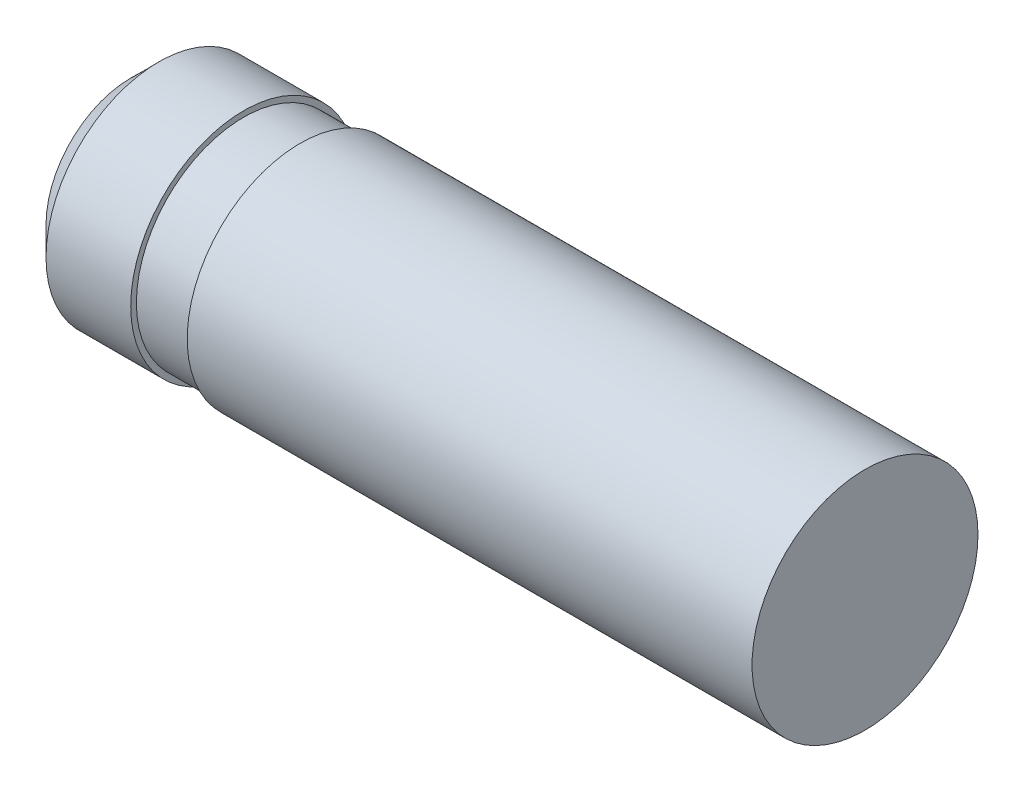
ISO-10303-21;
HEADER;
FILE_DESCRIPTION(('STEP AP214'),'2;1');
FILE_NAME('part.step','',(''),(''),'','','');
FILE_SCHEMA(('AUTOMOTIVE_DESIGN { 1 0 10303 214 1 1 1 1 }'));
ENDSEC;
DATA;
#1=APPLICATION_CONTEXT('core data for automotive mechanical design processes');
#2=APPLICATION_PROTOCOL_DEFINITION('international standard','automotive_design',2000,#1);
#3=PRODUCT_CONTEXT('',#1,'mechanical');
#4=PRODUCT('Part','Part','',(#3));
#5=PRODUCT_RELATED_PRODUCT_CATEGORY('part','',(#4));
#6=PRODUCT_DEFINITION_FORMATION('','',#4);
#7=PRODUCT_DEFINITION_CONTEXT('part definition',#1,'design');
#8=PRODUCT_DEFINITION('design','',#6,#7);
#9=PRODUCT_DEFINITION_SHAPE('','',#8);
#10=(LENGTH_UNIT() NAMED_UNIT(*) SI_UNIT(.MILLI.,.METRE.));
#11=(NAMED_UNIT(*) PLANE_ANGLE_UNIT() SI_UNIT($,.RADIAN.));
#12=(NAMED_UNIT(*) SI_UNIT($,.STERADIAN.) SOLID_ANGLE_UNIT());
#13=UNCERTAINTY_MEASURE_WITH_UNIT(LENGTH_MEASURE(1.E-05),#10,'distance_accuracy_value','');
#14=(GEOMETRIC_REPRESENTATION_CONTEXT(3) GLOBAL_UNCERTAINTY_ASSIGNED_CONTEXT((#13)) GLOBAL_UNIT_ASSIGNED_CONTEXT((#10,
#11,#12)) REPRESENTATION_CONTEXT('',''));
#15=CARTESIAN_POINT('',(0.,0.,0.));
#16=DIRECTION('',(0.,0.,1.));
#17=DIRECTION('',(1.,0.,0.));
#18=AXIS2_PLACEMENT_3D('',#15,#16,#17);
#19=CARTESIAN_POINT('',(-10.,0.,0.));
#20=DIRECTION('',(1.,0.,0.));
#21=DIRECTION('',(0.,0.,-1.));
#22=AXIS2_PLACEMENT_3D('',#19,#20,#21);
#23=CYLINDRICAL_SURFACE('',#22,2.);
#24=CARTESIAN_POINT('',(-10.,0.,0.));
#25=DIRECTION('',(1.,0.,0.));
#26=DIRECTION('',(0.,0.,-1.));
#27=AXIS2_PLACEMENT_3D('',#24,#25,#26);
#28=CIRCLE('',#27,2.);
#29=CARTESIAN_POINT('',(-10.,0.,-2.));
#30=VERTEX_POINT('',#29);
#31=EDGE_CURVE('E62',#30,#30,#28,.T.);
#32=ORIENTED_EDGE('',*,*,#31,.T.);
#33=EDGE_LOOP('',(#32));
#34=FACE_BOUND('',#33,.T.);
#35=CARTESIAN_POINT('',(0.,0.,0.));
#36=DIRECTION('',(1.,0.,0.));
#37=DIRECTION('',(0.,0.,-1.));
#38=AXIS2_PLACEMENT_3D('',#35,#36,#37);
#39=CIRCLE('',#38,2.);
#40=CARTESIAN_POINT('',(0.,0.,-2.));
#41=VERTEX_POINT('',#40);
#42=EDGE_CURVE('E65',#41,#41,#39,.T.);
#43=ORIENTED_EDGE('',*,*,#42,.F.);
#44=EDGE_LOOP('',(#43));
#45=FACE_BOUND('',#44,.T.);
#46=ADVANCED_FACE('F43',(#34,#45),#23,.T.);
#47=CARTESIAN_POINT('',(-10.,0.,0.));
#48=DIRECTION('',(1.,0.,0.));
#49=DIRECTION('',(0.,0.,-1.));
#50=AXIS2_PLACEMENT_3D('',#47,#48,#49);
#51=PLANE('',#50);
#52=CARTESIAN_POINT('',(-10.,0.,0.));
#53=DIRECTION('',(-1.,0.,0.));
#54=DIRECTION('',(0.,0.,1.));
#55=AXIS2_PLACEMENT_3D('',#52,#53,#54);
#56=CIRCLE('',#55,1.9);
#57=CARTESIAN_POINT('',(-10.,0.,1.9));
#58=VERTEX_POINT('',#57);
#59=EDGE_CURVE('E57',#58,#58,#56,.T.);
#60=ORIENTED_EDGE('',*,*,#59,.F.);
#61=EDGE_LOOP('',(#60));
#62=FACE_BOUND('',#61,.T.);
#63=ORIENTED_EDGE('',*,*,#31,.F.);
#64=EDGE_LOOP('',(#63));
#65=FACE_BOUND('',#64,.T.);
#66=ADVANCED_FACE('F96',(#62,#65),#51,.F.);
#67=CARTESIAN_POINT('',(0.,0.,0.));
#68=DIRECTION('',(1.,0.,0.));
#69=DIRECTION('',(0.,0.,-1.));
#70=AXIS2_PLACEMENT_3D('',#67,#68,#69);
#71=PLANE('',#70);
#72=ORIENTED_EDGE('',*,*,#42,.T.);
#73=EDGE_LOOP('',(#72));
#74=FACE_BOUND('',#73,.T.);
#75=ADVANCED_FACE('F101',(#74),#71,.T.);
#76=CARTESIAN_POINT('',(-11.,0.,0.));
#77=DIRECTION('',(1.,0.,0.));
#78=DIRECTION('',(0.,0.,-1.));
#79=AXIS2_PLACEMENT_3D('',#76,#77,#78);
#80=CYLINDRICAL_SURFACE('',#79,1.9);
#81=CARTESIAN_POINT('',(-11.,0.,0.));
#82=DIRECTION('',(-1.,0.,0.));
#83=DIRECTION('',(0.,0.,1.));
#84=AXIS2_PLACEMENT_3D('',#81,#82,#83);
#85=CIRCLE('',#84,1.9);
#86=CARTESIAN_POINT('',(-11.,0.,1.9));
#87=VERTEX_POINT('',#86);
#88=EDGE_CURVE('E69',#87,#87,#85,.T.);
#89=ORIENTED_EDGE('',*,*,#88,.F.);
#90=EDGE_LOOP('',(#89));
#91=FACE_BOUND('',#90,.T.);
#92=ORIENTED_EDGE('',*,*,#59,.T.);
#93=EDGE_LOOP('',(#92));
#94=FACE_BOUND('',#93,.T.);
#95=ADVANCED_FACE('F107',(#91,#94),#80,.T.);
#96=CARTESIAN_POINT('',(-13.,0.,0.));
#97=DIRECTION('',(1.,0.,0.));
#98=DIRECTION('',(0.,0.,-1.));
#99=AXIS2_PLACEMENT_3D('',#96,#97,#98);
#100=CYLINDRICAL_SURFACE('',#99,2.);
#101=CARTESIAN_POINT('',(-12.5,0.,0.));
#102=DIRECTION('',(-1.,0.,0.));
#103=DIRECTION('',(0.,0.,1.));
#104=AXIS2_PLACEMENT_3D('',#101,#102,#103);
#105=CIRCLE('',#104,2.);
#106=CARTESIAN_POINT('',(-12.5,0.,2.));
#107=VERTEX_POINT('',#106);
#108=EDGE_CURVE('E10',#107,#107,#105,.F.);
#109=ORIENTED_EDGE('',*,*,#108,.T.);
#110=EDGE_LOOP('',(#109));
#111=FACE_BOUND('',#110,.T.);
#112=CARTESIAN_POINT('',(-11.,0.,0.));
#113=DIRECTION('',(-1.,0.,0.));
#114=DIRECTION('',(0.,0.,1.));
#115=AXIS2_PLACEMENT_3D('',#112,#113,#114);
#116=CIRCLE('',#115,2.);
#117=CARTESIAN_POINT('',(-11.,0.,2.));
#118=VERTEX_POINT('',#117);
#119=EDGE_CURVE('E76',#118,#118,#116,.T.);
#120=ORIENTED_EDGE('',*,*,#119,.T.);
#121=EDGE_LOOP('',(#120));
#122=FACE_BOUND('',#121,.T.);
#123=ADVANCED_FACE('F81',(#111,#122),#100,.T.);
#124=CARTESIAN_POINT('',(-13.,0.,0.));
#125=DIRECTION('',(-1.,0.,0.));
#126=DIRECTION('',(0.,0.,1.));
#127=AXIS2_PLACEMENT_3D('',#124,#125,#126);
#128=PLANE('',#127);
#129=CARTESIAN_POINT('',(-13.,0.,0.));
#130=DIRECTION('',(-1.,0.,0.));
#131=DIRECTION('',(0.,0.,1.));
#132=AXIS2_PLACEMENT_3D('',#129,#130,#131);
#133=CIRCLE('',#132,1.5);
#134=CARTESIAN_POINT('',(-13.,0.,1.5));
#135=VERTEX_POINT('',#134);
#136=EDGE_CURVE('E52',#135,#135,#133,.T.);
#137=ORIENTED_EDGE('',*,*,#136,.T.);
#138=EDGE_LOOP('',(#137));
#139=FACE_BOUND('',#138,.T.);
#140=ADVANCED_FACE('F85',(#139),#128,.T.);
#141=CARTESIAN_POINT('',(-11.,0.,0.));
#142=DIRECTION('',(-1.,0.,0.));
#143=DIRECTION('',(0.,0.,1.));
#144=AXIS2_PLACEMENT_3D('',#141,#142,#143);
#145=PLANE('',#144);
#146=ORIENTED_EDGE('',*,*,#88,.T.);
#147=EDGE_LOOP('',(#146));
#148=FACE_BOUND('',#147,.T.);
#149=ORIENTED_EDGE('',*,*,#119,.F.);
#150=EDGE_LOOP('',(#149));
#151=FACE_BOUND('',#150,.T.);
#152=ADVANCED_FACE('F83',(#148,#151),#145,.F.);
#153=CARTESIAN_POINT('',(-13.,0.,0.));
#154=DIRECTION('',(1.,0.,0.));
#155=DIRECTION('',(0.,0.,-1.));
#156=AXIS2_PLACEMENT_3D('',#153,#154,#155);
#157=CONICAL_SURFACE('',#156,1.5,0.785398163397447);
#158=ORIENTED_EDGE('',*,*,#108,.F.);
#159=EDGE_LOOP('',(#158));
#160=FACE_BOUND('',#159,.T.);
#161=ORIENTED_EDGE('',*,*,#136,.F.);
#162=EDGE_LOOP('',(#161));
#163=FACE_BOUND('',#162,.T.);
#164=ADVANCED_FACE('F46',(#160,#163),#157,.T.);
#165=CLOSED_SHELL('',(#46,#66,#75,#95,#123,#140,#152,#164));
#166=MANIFOLD_SOLID_BREP('B2',#165);
#167=ADVANCED_BREP_SHAPE_REPRESENTATION('',(#18,#166),#14);
#168=SHAPE_DEFINITION_REPRESENTATION(#9,#167);
ENDSEC;
END-ISO-10303-21;
